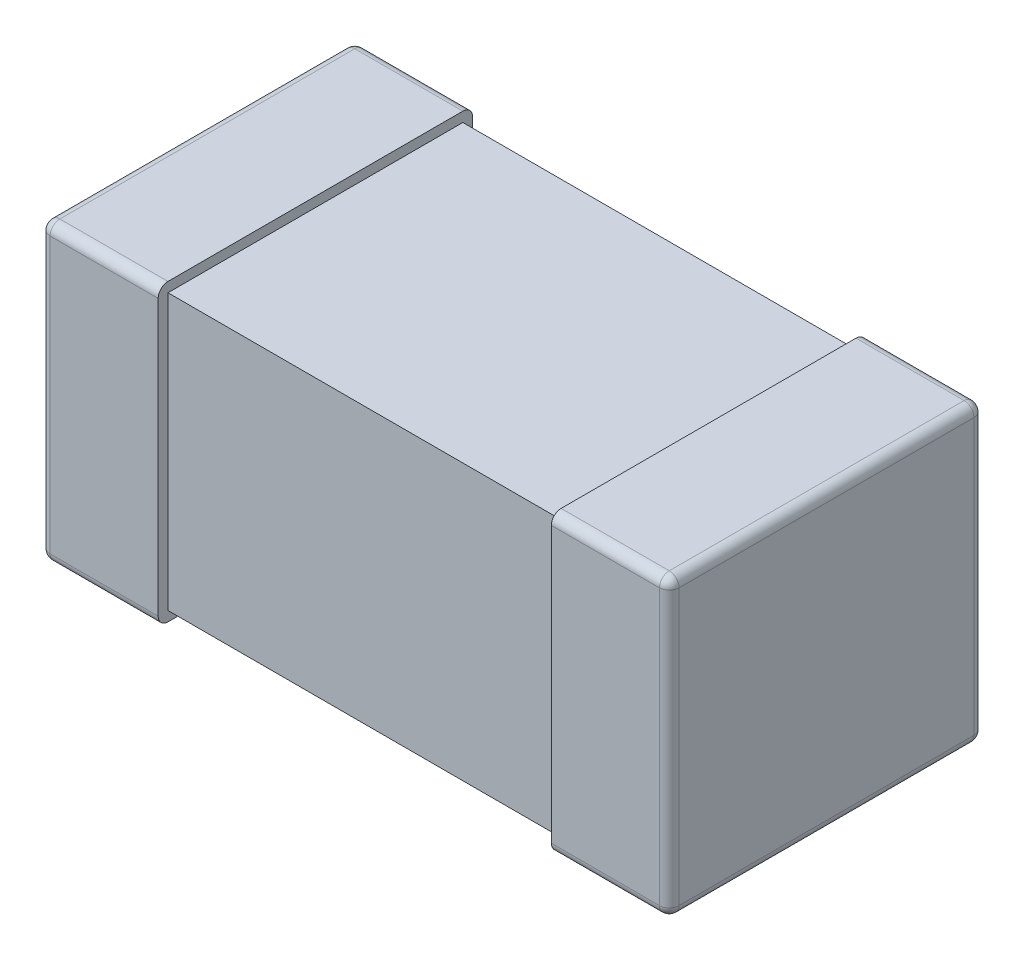
ISO-10303-21;
HEADER;
FILE_DESCRIPTION(('STEP AP214'),'2;1');
FILE_NAME('part.step','',(''),(''),'','','');
FILE_SCHEMA(('AUTOMOTIVE_DESIGN { 1 0 10303 214 1 1 1 1 }'));
ENDSEC;
DATA;
#1=APPLICATION_CONTEXT('core data for automotive mechanical design processes');
#2=APPLICATION_PROTOCOL_DEFINITION('international standard','automotive_design',2000,#1);
#3=PRODUCT_CONTEXT('',#1,'mechanical');
#4=PRODUCT('Part','Part','',(#3));
#5=PRODUCT_RELATED_PRODUCT_CATEGORY('part','',(#4));
#6=PRODUCT_DEFINITION_FORMATION('','',#4);
#7=PRODUCT_DEFINITION_CONTEXT('part definition',#1,'design');
#8=PRODUCT_DEFINITION('design','',#6,#7);
#9=PRODUCT_DEFINITION_SHAPE('','',#8);
#10=(LENGTH_UNIT() NAMED_UNIT(*) SI_UNIT(.MILLI.,.METRE.));
#11=(NAMED_UNIT(*) PLANE_ANGLE_UNIT() SI_UNIT($,.RADIAN.));
#12=(NAMED_UNIT(*) SI_UNIT($,.STERADIAN.) SOLID_ANGLE_UNIT());
#13=UNCERTAINTY_MEASURE_WITH_UNIT(LENGTH_MEASURE(1.E-05),#10,'distance_accuracy_value','');
#14=(GEOMETRIC_REPRESENTATION_CONTEXT(3) GLOBAL_UNCERTAINTY_ASSIGNED_CONTEXT((#13)) GLOBAL_UNIT_ASSIGNED_CONTEXT((#10,
#11,#12)) REPRESENTATION_CONTEXT('',''));
#15=CARTESIAN_POINT('',(0.,0.,0.));
#16=DIRECTION('',(0.,0.,1.));
#17=DIRECTION('',(1.,0.,0.));
#18=AXIS2_PLACEMENT_3D('',#15,#16,#17);
#19=CARTESIAN_POINT('',(1.6,-0.05,-0.8));
#20=DIRECTION('',(-1.,0.,0.));
#21=DIRECTION('',(0.,0.,1.));
#22=AXIS2_PLACEMENT_3D('',#19,#20,#21);
#23=PLANE('',#22);
#24=DIRECTION('',(0.,0.,-1.));
#25=VECTOR('',#24,1.);
#26=CARTESIAN_POINT('',(1.6,1.4,-0.8));
#27=LINE('',#26,#25);
#28=CARTESIAN_POINT('',(1.6,1.4,0.75));
#29=VERTEX_POINT('',#28);
#30=CARTESIAN_POINT('',(1.6,1.4,-0.75));
#31=VERTEX_POINT('',#30);
#32=EDGE_CURVE('E505',#29,#31,#27,.T.);
#33=ORIENTED_EDGE('',*,*,#32,.F.);
#34=DIRECTION('',(0.,1.,0.));
#35=VECTOR('',#34,1.);
#36=CARTESIAN_POINT('',(1.6,-0.05,0.75));
#37=LINE('',#36,#35);
#38=CARTESIAN_POINT('',(1.6,0.,0.75));
#39=VERTEX_POINT('',#38);
#40=EDGE_CURVE('E439',#39,#29,#37,.T.);
#41=ORIENTED_EDGE('',*,*,#40,.F.);
#42=DIRECTION('',(0.,0.,1.));
#43=VECTOR('',#42,1.);
#44=CARTESIAN_POINT('',(1.6,0.,0.8));
#45=LINE('',#44,#43);
#46=CARTESIAN_POINT('',(1.6,0.,-0.75));
#47=VERTEX_POINT('',#46);
#48=EDGE_CURVE('E496',#47,#39,#45,.T.);
#49=ORIENTED_EDGE('',*,*,#48,.F.);
#50=DIRECTION('',(0.,1.,0.));
#51=VECTOR('',#50,1.);
#52=CARTESIAN_POINT('',(1.6,-0.05,-0.75));
#53=LINE('',#52,#51);
#54=EDGE_CURVE('E390',#31,#47,#53,.F.);
#55=ORIENTED_EDGE('',*,*,#54,.F.);
#56=EDGE_LOOP('',(#33,#41,#49,#55));
#57=FACE_BOUND('',#56,.T.);
#58=ADVANCED_FACE('F16',(#57),#23,.F.);
#59=CARTESIAN_POINT('',(-1.6,-0.05,-0.8));
#60=DIRECTION('',(-1.,0.,0.));
#61=DIRECTION('',(0.,0.,1.));
#62=AXIS2_PLACEMENT_3D('',#59,#60,#61);
#63=PLANE('',#62);
#64=DIRECTION('',(0.,0.,-1.));
#65=VECTOR('',#64,1.);
#66=CARTESIAN_POINT('',(-1.6,0.,-0.8));
#67=LINE('',#66,#65);
#68=CARTESIAN_POINT('',(-1.6,0.,0.75));
#69=VERTEX_POINT('',#68);
#70=CARTESIAN_POINT('',(-1.6,0.,-0.75));
#71=VERTEX_POINT('',#70);
#72=EDGE_CURVE('E380',#69,#71,#67,.T.);
#73=ORIENTED_EDGE('',*,*,#72,.F.);
#74=DIRECTION('',(0.,1.,0.));
#75=VECTOR('',#74,1.);
#76=CARTESIAN_POINT('',(-1.6,-0.05,0.75));
#77=LINE('',#76,#75);
#78=CARTESIAN_POINT('',(-1.6,1.4,0.75));
#79=VERTEX_POINT('',#78);
#80=EDGE_CURVE('E479',#79,#69,#77,.F.);
#81=ORIENTED_EDGE('',*,*,#80,.F.);
#82=DIRECTION('',(0.,0.,1.));
#83=VECTOR('',#82,1.);
#84=CARTESIAN_POINT('',(-1.6,1.4,0.8));
#85=LINE('',#84,#83);
#86=CARTESIAN_POINT('',(-1.6,1.4,-0.75));
#87=VERTEX_POINT('',#86);
#88=EDGE_CURVE('E340',#87,#79,#85,.T.);
#89=ORIENTED_EDGE('',*,*,#88,.F.);
#90=DIRECTION('',(0.,1.,0.));
#91=VECTOR('',#90,1.);
#92=CARTESIAN_POINT('',(-1.6,-0.05,-0.75));
#93=LINE('',#92,#91);
#94=EDGE_CURVE('E488',#71,#87,#93,.T.);
#95=ORIENTED_EDGE('',*,*,#94,.F.);
#96=EDGE_LOOP('',(#73,#81,#89,#95));
#97=FACE_BOUND('',#96,.T.);
#98=ADVANCED_FACE('F469',(#97),#63,.T.);
#99=CARTESIAN_POINT('',(1.55,1.4,-0.75));
#100=DIRECTION('',(1.,0.,0.));
#101=DIRECTION('',(0.,0.,-1.));
#102=AXIS2_PLACEMENT_3D('',#99,#100,#101);
#103=SPHERICAL_SURFACE('',#102,0.05);
#104=CARTESIAN_POINT('',(1.55,1.4,-0.75));
#105=DIRECTION('',(0.,0.,-1.));
#106=DIRECTION('',(-1.,0.,0.));
#107=AXIS2_PLACEMENT_3D('',#104,#105,#106);
#108=CIRCLE('',#107,0.05);
#109=CARTESIAN_POINT('',(1.55,1.45,-0.75));
#110=VERTEX_POINT('',#109);
#111=EDGE_CURVE('E508',#31,#110,#108,.F.);
#112=ORIENTED_EDGE('',*,*,#111,.F.);
#113=CARTESIAN_POINT('',(1.55,1.4,-0.75));
#114=DIRECTION('',(0.,1.,0.));
#115=DIRECTION('',(0.,0.,1.));
#116=AXIS2_PLACEMENT_3D('',#113,#114,#115);
#117=CIRCLE('',#116,0.05);
#118=CARTESIAN_POINT('',(1.55,1.4,-0.8));
#119=VERTEX_POINT('',#118);
#120=EDGE_CURVE('E401',#119,#31,#117,.F.);
#121=ORIENTED_EDGE('',*,*,#120,.F.);
#122=CARTESIAN_POINT('',(1.55,1.4,-0.75));
#123=DIRECTION('',(-1.,0.,0.));
#124=DIRECTION('',(0.,0.,1.));
#125=AXIS2_PLACEMENT_3D('',#122,#123,#124);
#126=CIRCLE('',#125,0.05);
#127=EDGE_CURVE('E397',#110,#119,#126,.T.);
#128=ORIENTED_EDGE('',*,*,#127,.F.);
#129=EDGE_LOOP('',(#112,#121,#128));
#130=FACE_BOUND('',#129,.T.);
#131=ADVANCED_FACE('F465',(#130),#103,.T.);
#132=CARTESIAN_POINT('',(1.55,1.4,-0.8));
#133=DIRECTION('',(0.,0.,-1.));
#134=DIRECTION('',(-1.,0.,0.));
#135=AXIS2_PLACEMENT_3D('',#132,#133,#134);
#136=CYLINDRICAL_SURFACE('',#135,0.05);
#137=ORIENTED_EDGE('',*,*,#111,.T.);
#138=DIRECTION('',(0.,0.,1.));
#139=VECTOR('',#138,1.);
#140=CARTESIAN_POINT('',(1.55,1.45,0.8));
#141=LINE('',#140,#139);
#142=CARTESIAN_POINT('',(1.55,1.45,0.75));
#143=VERTEX_POINT('',#142);
#144=EDGE_CURVE('E193',#143,#110,#141,.F.);
#145=ORIENTED_EDGE('',*,*,#144,.F.);
#146=CARTESIAN_POINT('',(1.55,1.4,0.75));
#147=DIRECTION('',(0.,0.,1.));
#148=DIRECTION('',(1.,0.,0.));
#149=AXIS2_PLACEMENT_3D('',#146,#147,#148);
#150=CIRCLE('',#149,0.05);
#151=EDGE_CURVE('E445',#29,#143,#150,.T.);
#152=ORIENTED_EDGE('',*,*,#151,.F.);
#153=ORIENTED_EDGE('',*,*,#32,.T.);
#154=EDGE_LOOP('',(#137,#145,#152,#153));
#155=FACE_BOUND('',#154,.T.);
#156=ADVANCED_FACE('F461',(#155),#136,.T.);
#157=CARTESIAN_POINT('',(1.55,1.4,0.75));
#158=DIRECTION('',(1.,0.,0.));
#159=DIRECTION('',(0.,0.,-1.));
#160=AXIS2_PLACEMENT_3D('',#157,#158,#159);
#161=SPHERICAL_SURFACE('',#160,0.05);
#162=CARTESIAN_POINT('',(1.55,1.4,0.75));
#163=DIRECTION('',(1.,0.,0.));
#164=DIRECTION('',(0.,0.,-1.));
#165=AXIS2_PLACEMENT_3D('',#162,#163,#164);
#166=CIRCLE('',#165,0.05);
#167=CARTESIAN_POINT('',(1.55,1.4,0.8));
#168=VERTEX_POINT('',#167);
#169=EDGE_CURVE('E194',#168,#143,#166,.F.);
#170=ORIENTED_EDGE('',*,*,#169,.F.);
#171=CARTESIAN_POINT('',(1.55,1.4,0.75));
#172=DIRECTION('',(0.,1.,0.));
#173=DIRECTION('',(0.,0.,1.));
#174=AXIS2_PLACEMENT_3D('',#171,#172,#173);
#175=CIRCLE('',#174,0.05);
#176=EDGE_CURVE('E442',#29,#168,#175,.F.);
#177=ORIENTED_EDGE('',*,*,#176,.F.);
#178=ORIENTED_EDGE('',*,*,#151,.T.);
#179=EDGE_LOOP('',(#170,#177,#178));
#180=FACE_BOUND('',#179,.T.);
#181=ADVANCED_FACE('F458',(#180),#161,.T.);
#182=CARTESIAN_POINT('',(1.55,-0.05,0.75));
#183=DIRECTION('',(0.,1.,0.));
#184=DIRECTION('',(0.,0.,1.));
#185=AXIS2_PLACEMENT_3D('',#182,#183,#184);
#186=CYLINDRICAL_SURFACE('',#185,0.05);
#187=CARTESIAN_POINT('',(1.55,0.,0.75));
#188=DIRECTION('',(0.,-1.,0.));
#189=DIRECTION('',(1.,0.,0.));
#190=AXIS2_PLACEMENT_3D('',#187,#188,#189);
#191=CIRCLE('',#190,0.05);
#192=CARTESIAN_POINT('',(1.55,0.,0.8));
#193=VERTEX_POINT('',#192);
#194=EDGE_CURVE('E435',#39,#193,#191,.T.);
#195=ORIENTED_EDGE('',*,*,#194,.F.);
#196=ORIENTED_EDGE('',*,*,#40,.T.);
#197=ORIENTED_EDGE('',*,*,#176,.T.);
#198=DIRECTION('',(0.,1.,0.));
#199=VECTOR('',#198,1.);
#200=CARTESIAN_POINT('',(1.55,-0.05,0.8));
#201=LINE('',#200,#199);
#202=EDGE_CURVE('E293',#168,#193,#201,.F.);
#203=ORIENTED_EDGE('',*,*,#202,.T.);
#204=EDGE_LOOP('',(#195,#196,#197,#203));
#205=FACE_BOUND('',#204,.T.);
#206=ADVANCED_FACE('F427',(#205),#186,.T.);
#207=CARTESIAN_POINT('',(1.55,0.,0.75));
#208=DIRECTION('',(1.,0.,0.));
#209=DIRECTION('',(0.,0.,-1.));
#210=AXIS2_PLACEMENT_3D('',#207,#208,#209);
#211=SPHERICAL_SURFACE('',#210,0.05);
#212=CARTESIAN_POINT('',(1.55,0.,0.75));
#213=DIRECTION('',(-1.,0.,0.));
#214=DIRECTION('',(0.,0.,1.));
#215=AXIS2_PLACEMENT_3D('',#212,#213,#214);
#216=CIRCLE('',#215,0.05);
#217=CARTESIAN_POINT('',(1.55,-0.05,0.75));
#218=VERTEX_POINT('',#217);
#219=EDGE_CURVE('E287',#218,#193,#216,.T.);
#220=ORIENTED_EDGE('',*,*,#219,.F.);
#221=CARTESIAN_POINT('',(1.55,0.,0.75));
#222=DIRECTION('',(0.,0.,1.));
#223=DIRECTION('',(1.,0.,0.));
#224=AXIS2_PLACEMENT_3D('',#221,#222,#223);
#225=CIRCLE('',#224,0.05);
#226=EDGE_CURVE('E438',#39,#218,#225,.F.);
#227=ORIENTED_EDGE('',*,*,#226,.F.);
#228=ORIENTED_EDGE('',*,*,#194,.T.);
#229=EDGE_LOOP('',(#220,#227,#228));
#230=FACE_BOUND('',#229,.T.);
#231=ADVANCED_FACE('F422',(#230),#211,.T.);
#232=CARTESIAN_POINT('',(1.55,0.,0.8));
#233=DIRECTION('',(0.,0.,1.));
#234=DIRECTION('',(1.,0.,0.));
#235=AXIS2_PLACEMENT_3D('',#232,#233,#234);
#236=CYLINDRICAL_SURFACE('',#235,0.05);
#237=CARTESIAN_POINT('',(1.55,0.,-0.75));
#238=DIRECTION('',(0.,0.,-1.));
#239=DIRECTION('',(1.,0.,0.));
#240=AXIS2_PLACEMENT_3D('',#237,#238,#239);
#241=CIRCLE('',#240,0.05);
#242=CARTESIAN_POINT('',(1.55,-0.05,-0.75));
#243=VERTEX_POINT('',#242);
#244=EDGE_CURVE('E404',#47,#243,#241,.T.);
#245=ORIENTED_EDGE('',*,*,#244,.F.);
#246=ORIENTED_EDGE('',*,*,#48,.T.);
#247=ORIENTED_EDGE('',*,*,#226,.T.);
#248=DIRECTION('',(0.,0.,1.));
#249=VECTOR('',#248,1.);
#250=CARTESIAN_POINT('',(1.55,-0.05,0.8));
#251=LINE('',#250,#249);
#252=EDGE_CURVE('E281',#218,#243,#251,.F.);
#253=ORIENTED_EDGE('',*,*,#252,.T.);
#254=EDGE_LOOP('',(#245,#246,#247,#253));
#255=FACE_BOUND('',#254,.T.);
#256=ADVANCED_FACE('F418',(#255),#236,.T.);
#257=CARTESIAN_POINT('',(1.55,0.,-0.75));
#258=DIRECTION('',(1.,0.,0.));
#259=DIRECTION('',(0.,0.,-1.));
#260=AXIS2_PLACEMENT_3D('',#257,#258,#259);
#261=SPHERICAL_SURFACE('',#260,0.05);
#262=ORIENTED_EDGE('',*,*,#244,.T.);
#263=CARTESIAN_POINT('',(1.55,0.,-0.75));
#264=DIRECTION('',(1.,0.,0.));
#265=DIRECTION('',(0.,0.,-1.));
#266=AXIS2_PLACEMENT_3D('',#263,#264,#265);
#267=CIRCLE('',#266,0.05);
#268=CARTESIAN_POINT('',(1.55,0.,-0.8));
#269=VERTEX_POINT('',#268);
#270=EDGE_CURVE('E275',#269,#243,#267,.F.);
#271=ORIENTED_EDGE('',*,*,#270,.F.);
#272=CARTESIAN_POINT('',(1.55,0.,-0.75));
#273=DIRECTION('',(0.,1.,0.));
#274=DIRECTION('',(0.,0.,1.));
#275=AXIS2_PLACEMENT_3D('',#272,#273,#274);
#276=CIRCLE('',#275,0.05);
#277=EDGE_CURVE('E387',#47,#269,#276,.T.);
#278=ORIENTED_EDGE('',*,*,#277,.F.);
#279=EDGE_LOOP('',(#262,#271,#278));
#280=FACE_BOUND('',#279,.T.);
#281=ADVANCED_FACE('F414',(#280),#261,.T.);
#282=CARTESIAN_POINT('',(1.55,-0.05,-0.75));
#283=DIRECTION('',(0.,1.,0.));
#284=DIRECTION('',(0.,0.,1.));
#285=AXIS2_PLACEMENT_3D('',#282,#283,#284);
#286=CYLINDRICAL_SURFACE('',#285,0.05);
#287=ORIENTED_EDGE('',*,*,#277,.T.);
#288=DIRECTION('',(0.,1.,0.));
#289=VECTOR('',#288,1.);
#290=CARTESIAN_POINT('',(1.55,-0.05,-0.8));
#291=LINE('',#290,#289);
#292=EDGE_CURVE('E263',#269,#119,#291,.T.);
#293=ORIENTED_EDGE('',*,*,#292,.T.);
#294=ORIENTED_EDGE('',*,*,#120,.T.);
#295=ORIENTED_EDGE('',*,*,#54,.T.);
#296=EDGE_LOOP('',(#287,#293,#294,#295));
#297=FACE_BOUND('',#296,.T.);
#298=ADVANCED_FACE('F417',(#297),#286,.T.);
#299=CARTESIAN_POINT('',(-1.55,0.,-0.8));
#300=DIRECTION('',(0.,0.,-1.));
#301=DIRECTION('',(-1.,0.,0.));
#302=AXIS2_PLACEMENT_3D('',#299,#300,#301);
#303=CYLINDRICAL_SURFACE('',#302,0.05);
#304=CARTESIAN_POINT('',(-1.55,0.,-0.75));
#305=DIRECTION('',(0.,0.,-1.));
#306=DIRECTION('',(1.,0.,0.));
#307=AXIS2_PLACEMENT_3D('',#304,#305,#306);
#308=CIRCLE('',#307,0.05);
#309=CARTESIAN_POINT('',(-1.55,-0.05,-0.75));
#310=VERTEX_POINT('',#309);
#311=EDGE_CURVE('E376',#310,#71,#308,.T.);
#312=ORIENTED_EDGE('',*,*,#311,.F.);
#313=DIRECTION('',(0.,0.,1.));
#314=VECTOR('',#313,1.);
#315=CARTESIAN_POINT('',(-1.55,-0.05,0.8));
#316=LINE('',#315,#314);
#317=CARTESIAN_POINT('',(-1.55,-0.05,0.75));
#318=VERTEX_POINT('',#317);
#319=EDGE_CURVE('E258',#310,#318,#316,.T.);
#320=ORIENTED_EDGE('',*,*,#319,.T.);
#321=CARTESIAN_POINT('',(-1.55,0.,0.75));
#322=DIRECTION('',(0.,0.,-1.));
#323=DIRECTION('',(1.,0.,0.));
#324=AXIS2_PLACEMENT_3D('',#321,#322,#323);
#325=CIRCLE('',#324,0.05);
#326=EDGE_CURVE('E311',#69,#318,#325,.F.);
#327=ORIENTED_EDGE('',*,*,#326,.F.);
#328=ORIENTED_EDGE('',*,*,#72,.T.);
#329=EDGE_LOOP('',(#312,#320,#327,#328));
#330=FACE_BOUND('',#329,.T.);
#331=ADVANCED_FACE('F368',(#330),#303,.T.);
#332=CARTESIAN_POINT('',(-1.55,0.,-0.75));
#333=DIRECTION('',(1.,0.,0.));
#334=DIRECTION('',(0.,0.,-1.));
#335=AXIS2_PLACEMENT_3D('',#332,#333,#334);
#336=SPHERICAL_SURFACE('',#335,0.05);
#337=CARTESIAN_POINT('',(-1.55,0.,-0.75));
#338=DIRECTION('',(0.,1.,0.));
#339=DIRECTION('',(0.,0.,1.));
#340=AXIS2_PLACEMENT_3D('',#337,#338,#339);
#341=CIRCLE('',#340,0.05);
#342=CARTESIAN_POINT('',(-1.55,0.,-0.8));
#343=VERTEX_POINT('',#342);
#344=EDGE_CURVE('E379',#343,#71,#341,.T.);
#345=ORIENTED_EDGE('',*,*,#344,.F.);
#346=CARTESIAN_POINT('',(-1.55,0.,-0.75));
#347=DIRECTION('',(1.,0.,0.));
#348=DIRECTION('',(0.,0.,-1.));
#349=AXIS2_PLACEMENT_3D('',#346,#347,#348);
#350=CIRCLE('',#349,0.05);
#351=EDGE_CURVE('E252',#310,#343,#350,.T.);
#352=ORIENTED_EDGE('',*,*,#351,.F.);
#353=ORIENTED_EDGE('',*,*,#311,.T.);
#354=EDGE_LOOP('',(#345,#352,#353));
#355=FACE_BOUND('',#354,.T.);
#356=ADVANCED_FACE('F363',(#355),#336,.T.);
#357=CARTESIAN_POINT('',(-1.55,-0.05,-0.75));
#358=DIRECTION('',(0.,1.,0.));
#359=DIRECTION('',(0.,0.,1.));
#360=AXIS2_PLACEMENT_3D('',#357,#358,#359);
#361=CYLINDRICAL_SURFACE('',#360,0.05);
#362=ORIENTED_EDGE('',*,*,#344,.T.);
#363=ORIENTED_EDGE('',*,*,#94,.T.);
#364=CARTESIAN_POINT('',(-1.55,1.4,-0.75));
#365=DIRECTION('',(0.,1.,0.));
#366=DIRECTION('',(1.,0.,0.));
#367=AXIS2_PLACEMENT_3D('',#364,#365,#366);
#368=CIRCLE('',#367,0.05);
#369=CARTESIAN_POINT('',(-1.55,1.4,-0.8));
#370=VERTEX_POINT('',#369);
#371=EDGE_CURVE('E346',#370,#87,#368,.T.);
#372=ORIENTED_EDGE('',*,*,#371,.F.);
#373=DIRECTION('',(0.,1.,0.));
#374=VECTOR('',#373,1.);
#375=CARTESIAN_POINT('',(-1.55,-0.05,-0.8));
#376=LINE('',#375,#374);
#377=EDGE_CURVE('E246',#343,#370,#376,.T.);
#378=ORIENTED_EDGE('',*,*,#377,.F.);
#379=EDGE_LOOP('',(#362,#363,#372,#378));
#380=FACE_BOUND('',#379,.T.);
#381=ADVANCED_FACE('F359',(#380),#361,.T.);
#382=CARTESIAN_POINT('',(-1.55,1.4,-0.75));
#383=DIRECTION('',(1.,0.,0.));
#384=DIRECTION('',(0.,0.,-1.));
#385=AXIS2_PLACEMENT_3D('',#382,#383,#384);
#386=SPHERICAL_SURFACE('',#385,0.05);
#387=CARTESIAN_POINT('',(-1.55,1.4,-0.75));
#388=DIRECTION('',(-1.,0.,0.));
#389=DIRECTION('',(0.,0.,1.));
#390=AXIS2_PLACEMENT_3D('',#387,#388,#389);
#391=CIRCLE('',#390,0.05);
#392=CARTESIAN_POINT('',(-1.55,1.45,-0.75));
#393=VERTEX_POINT('',#392);
#394=EDGE_CURVE('E240',#370,#393,#391,.F.);
#395=ORIENTED_EDGE('',*,*,#394,.F.);
#396=ORIENTED_EDGE('',*,*,#371,.T.);
#397=CARTESIAN_POINT('',(-1.55,1.4,-0.75));
#398=DIRECTION('',(0.,0.,1.));
#399=DIRECTION('',(1.,0.,0.));
#400=AXIS2_PLACEMENT_3D('',#397,#398,#399);
#401=CIRCLE('',#400,0.05);
#402=EDGE_CURVE('E343',#393,#87,#401,.T.);
#403=ORIENTED_EDGE('',*,*,#402,.F.);
#404=EDGE_LOOP('',(#395,#396,#403));
#405=FACE_BOUND('',#404,.T.);
#406=ADVANCED_FACE('F356',(#405),#386,.T.);
#407=CARTESIAN_POINT('',(-1.55,1.4,0.8));
#408=DIRECTION('',(0.,0.,1.));
#409=DIRECTION('',(1.,0.,0.));
#410=AXIS2_PLACEMENT_3D('',#407,#408,#409);
#411=CYLINDRICAL_SURFACE('',#410,0.05);
#412=ORIENTED_EDGE('',*,*,#402,.T.);
#413=ORIENTED_EDGE('',*,*,#88,.T.);
#414=CARTESIAN_POINT('',(-1.55,1.4,0.75));
#415=DIRECTION('',(0.,0.,1.));
#416=DIRECTION('',(1.,0.,0.));
#417=AXIS2_PLACEMENT_3D('',#414,#415,#416);
#418=CIRCLE('',#417,0.05);
#419=CARTESIAN_POINT('',(-1.55,1.45,0.75));
#420=VERTEX_POINT('',#419);
#421=EDGE_CURVE('E336',#420,#79,#418,.T.);
#422=ORIENTED_EDGE('',*,*,#421,.F.);
#423=DIRECTION('',(0.,0.,1.));
#424=VECTOR('',#423,1.);
#425=CARTESIAN_POINT('',(-1.55,1.45,0.8));
#426=LINE('',#425,#424);
#427=EDGE_CURVE('E239',#393,#420,#426,.T.);
#428=ORIENTED_EDGE('',*,*,#427,.F.);
#429=EDGE_LOOP('',(#412,#413,#422,#428));
#430=FACE_BOUND('',#429,.T.);
#431=ADVANCED_FACE('F328',(#430),#411,.T.);
#432=CARTESIAN_POINT('',(-1.55,1.4,0.75));
#433=DIRECTION('',(1.,0.,0.));
#434=DIRECTION('',(0.,0.,-1.));
#435=AXIS2_PLACEMENT_3D('',#432,#433,#434);
#436=SPHERICAL_SURFACE('',#435,0.05);
#437=CARTESIAN_POINT('',(-1.55,1.4,0.75));
#438=DIRECTION('',(1.,0.,0.));
#439=DIRECTION('',(0.,0.,-1.));
#440=AXIS2_PLACEMENT_3D('',#437,#438,#439);
#441=CIRCLE('',#440,0.05);
#442=CARTESIAN_POINT('',(-1.55,1.4,0.8));
#443=VERTEX_POINT('',#442);
#444=EDGE_CURVE('E233',#420,#443,#441,.T.);
#445=ORIENTED_EDGE('',*,*,#444,.F.);
#446=ORIENTED_EDGE('',*,*,#421,.T.);
#447=CARTESIAN_POINT('',(-1.55,1.4,0.75));
#448=DIRECTION('',(0.,1.,0.));
#449=DIRECTION('',(0.,0.,1.));
#450=AXIS2_PLACEMENT_3D('',#447,#448,#449);
#451=CIRCLE('',#450,0.05);
#452=EDGE_CURVE('E339',#443,#79,#451,.F.);
#453=ORIENTED_EDGE('',*,*,#452,.F.);
#454=EDGE_LOOP('',(#445,#446,#453));
#455=FACE_BOUND('',#454,.T.);
#456=ADVANCED_FACE('F323',(#455),#436,.T.);
#457=CARTESIAN_POINT('',(-1.55,-0.05,0.75));
#458=DIRECTION('',(0.,1.,0.));
#459=DIRECTION('',(0.,0.,1.));
#460=AXIS2_PLACEMENT_3D('',#457,#458,#459);
#461=CYLINDRICAL_SURFACE('',#460,0.05);
#462=CARTESIAN_POINT('',(-1.55,0.,0.75));
#463=DIRECTION('',(0.,-1.,0.));
#464=DIRECTION('',(1.,0.,0.));
#465=AXIS2_PLACEMENT_3D('',#462,#463,#464);
#466=CIRCLE('',#465,0.05);
#467=CARTESIAN_POINT('',(-1.55,0.,0.8));
#468=VERTEX_POINT('',#467);
#469=EDGE_CURVE('E482',#468,#69,#466,.T.);
#470=ORIENTED_EDGE('',*,*,#469,.F.);
#471=DIRECTION('',(0.,1.,0.));
#472=VECTOR('',#471,1.);
#473=CARTESIAN_POINT('',(-1.55,-0.05,0.8));
#474=LINE('',#473,#472);
#475=EDGE_CURVE('E227',#443,#468,#474,.F.);
#476=ORIENTED_EDGE('',*,*,#475,.F.);
#477=ORIENTED_EDGE('',*,*,#452,.T.);
#478=ORIENTED_EDGE('',*,*,#80,.T.);
#479=EDGE_LOOP('',(#470,#476,#477,#478));
#480=FACE_BOUND('',#479,.T.);
#481=ADVANCED_FACE('F318',(#480),#461,.T.);
#482=CARTESIAN_POINT('',(-1.55,0.,0.75));
#483=DIRECTION('',(1.,0.,0.));
#484=DIRECTION('',(0.,0.,-1.));
#485=AXIS2_PLACEMENT_3D('',#482,#483,#484);
#486=SPHERICAL_SURFACE('',#485,0.05);
#487=ORIENTED_EDGE('',*,*,#469,.T.);
#488=ORIENTED_EDGE('',*,*,#326,.T.);
#489=CARTESIAN_POINT('',(-1.55,0.,0.75));
#490=DIRECTION('',(-1.,0.,0.));
#491=DIRECTION('',(0.,0.,1.));
#492=AXIS2_PLACEMENT_3D('',#489,#490,#491);
#493=CIRCLE('',#492,0.05);
#494=EDGE_CURVE('E216',#468,#318,#493,.F.);
#495=ORIENTED_EDGE('',*,*,#494,.F.);
#496=EDGE_LOOP('',(#487,#488,#495));
#497=FACE_BOUND('',#496,.T.);
#498=ADVANCED_FACE('F314',(#497),#486,.T.);
#499=CARTESIAN_POINT('',(1.6,1.4,-0.75));
#500=DIRECTION('',(-1.,0.,0.));
#501=DIRECTION('',(0.,0.,1.));
#502=AXIS2_PLACEMENT_3D('',#499,#500,#501);
#503=CYLINDRICAL_SURFACE('',#502,0.05);
#504=ORIENTED_EDGE('',*,*,#127,.T.);
#505=DIRECTION('',(1.,0.,0.));
#506=VECTOR('',#505,1.);
#507=CARTESIAN_POINT('',(1.6,1.4,-0.8));
#508=LINE('',#507,#506);
#509=CARTESIAN_POINT('',(1.,1.4,-0.8));
#510=VERTEX_POINT('',#509);
#511=EDGE_CURVE('E176',#119,#510,#508,.F.);
#512=ORIENTED_EDGE('',*,*,#511,.T.);
#513=CARTESIAN_POINT('',(1.,1.4,-0.75));
#514=DIRECTION('',(-1.,0.,0.));
#515=DIRECTION('',(0.,0.,1.));
#516=AXIS2_PLACEMENT_3D('',#513,#514,#515);
#517=CIRCLE('',#516,0.05);
#518=CARTESIAN_POINT('',(1.,1.45,-0.75));
#519=VERTEX_POINT('',#518);
#520=EDGE_CURVE('E19',#510,#519,#517,.F.);
#521=ORIENTED_EDGE('',*,*,#520,.T.);
#522=DIRECTION('',(1.,0.,0.));
#523=VECTOR('',#522,1.);
#524=CARTESIAN_POINT('',(1.6,1.45,-0.75));
#525=LINE('',#524,#523);
#526=EDGE_CURVE('E182',#110,#519,#525,.F.);
#527=ORIENTED_EDGE('',*,*,#526,.F.);
#528=EDGE_LOOP('',(#504,#512,#521,#527));
#529=FACE_BOUND('',#528,.T.);
#530=ADVANCED_FACE('F181',(#529),#503,.T.);
#531=CARTESIAN_POINT('',(1.6,1.45,0.8));
#532=DIRECTION('',(0.,1.,0.));
#533=DIRECTION('',(0.,0.,1.));
#534=AXIS2_PLACEMENT_3D('',#531,#532,#533);
#535=PLANE('',#534);
#536=DIRECTION('',(0.,0.,-1.));
#537=VECTOR('',#536,1.);
#538=CARTESIAN_POINT('',(1.,1.45,-0.8));
#539=LINE('',#538,#537);
#540=CARTESIAN_POINT('',(1.,1.45,0.75));
#541=VERTEX_POINT('',#540);
#542=EDGE_CURVE('E187',#519,#541,#539,.F.);
#543=ORIENTED_EDGE('',*,*,#542,.T.);
#544=DIRECTION('',(1.,0.,0.));
#545=VECTOR('',#544,1.);
#546=CARTESIAN_POINT('',(1.6,1.45,0.75));
#547=LINE('',#546,#545);
#548=EDGE_CURVE('E294',#143,#541,#547,.F.);
#549=ORIENTED_EDGE('',*,*,#548,.F.);
#550=ORIENTED_EDGE('',*,*,#144,.T.);
#551=ORIENTED_EDGE('',*,*,#526,.T.);
#552=EDGE_LOOP('',(#543,#549,#550,#551));
#553=FACE_BOUND('',#552,.T.);
#554=ADVANCED_FACE('F190',(#553),#535,.T.);
#555=CARTESIAN_POINT('',(1.6,1.4,0.75));
#556=DIRECTION('',(1.,0.,0.));
#557=DIRECTION('',(0.,0.,-1.));
#558=AXIS2_PLACEMENT_3D('',#555,#556,#557);
#559=CYLINDRICAL_SURFACE('',#558,0.05);
#560=CARTESIAN_POINT('',(1.,1.4,0.75));
#561=DIRECTION('',(1.,0.,0.));
#562=DIRECTION('',(0.,0.,-1.));
#563=AXIS2_PLACEMENT_3D('',#560,#561,#562);
#564=CIRCLE('',#563,0.05);
#565=CARTESIAN_POINT('',(1.,1.4,0.8));
#566=VERTEX_POINT('',#565);
#567=EDGE_CURVE('E201',#541,#566,#564,.T.);
#568=ORIENTED_EDGE('',*,*,#567,.T.);
#569=DIRECTION('',(-1.,0.,0.));
#570=VECTOR('',#569,1.);
#571=CARTESIAN_POINT('',(1.6,1.4,0.8));
#572=LINE('',#571,#570);
#573=EDGE_CURVE('E290',#566,#168,#572,.F.);
#574=ORIENTED_EDGE('',*,*,#573,.T.);
#575=ORIENTED_EDGE('',*,*,#169,.T.);
#576=ORIENTED_EDGE('',*,*,#548,.T.);
#577=EDGE_LOOP('',(#568,#574,#575,#576));
#578=FACE_BOUND('',#577,.T.);
#579=ADVANCED_FACE('F569',(#578),#559,.T.);
#580=CARTESIAN_POINT('',(1.6,-0.05,0.8));
#581=DIRECTION('',(0.,0.,-1.));
#582=DIRECTION('',(-1.,0.,0.));
#583=AXIS2_PLACEMENT_3D('',#580,#581,#582);
#584=PLANE('',#583);
#585=DIRECTION('',(-1.,0.,0.));
#586=VECTOR('',#585,1.);
#587=CARTESIAN_POINT('',(1.6,0.,0.8));
#588=LINE('',#587,#586);
#589=CARTESIAN_POINT('',(1.,0.,0.8));
#590=VERTEX_POINT('',#589);
#591=EDGE_CURVE('E282',#193,#590,#588,.T.);
#592=ORIENTED_EDGE('',*,*,#591,.F.);
#593=ORIENTED_EDGE('',*,*,#202,.F.);
#594=ORIENTED_EDGE('',*,*,#573,.F.);
#595=DIRECTION('',(0.,1.,0.));
#596=VECTOR('',#595,1.);
#597=CARTESIAN_POINT('',(1.,-0.05,0.8));
#598=LINE('',#597,#596);
#599=EDGE_CURVE('E203',#566,#590,#598,.F.);
#600=ORIENTED_EDGE('',*,*,#599,.T.);
#601=EDGE_LOOP('',(#592,#593,#594,#600));
#602=FACE_BOUND('',#601,.T.);
#603=ADVANCED_FACE('F539',(#602),#584,.F.);
#604=CARTESIAN_POINT('',(1.6,0.,0.75));
#605=DIRECTION('',(-1.,0.,0.));
#606=DIRECTION('',(0.,0.,1.));
#607=AXIS2_PLACEMENT_3D('',#604,#605,#606);
#608=CYLINDRICAL_SURFACE('',#607,0.05);
#609=ORIENTED_EDGE('',*,*,#219,.T.);
#610=ORIENTED_EDGE('',*,*,#591,.T.);
#611=CARTESIAN_POINT('',(1.,0.,0.75));
#612=DIRECTION('',(-1.,0.,0.));
#613=DIRECTION('',(0.,0.,1.));
#614=AXIS2_PLACEMENT_3D('',#611,#612,#613);
#615=CIRCLE('',#614,0.05);
#616=CARTESIAN_POINT('',(1.,-0.05,0.75));
#617=VERTEX_POINT('',#616);
#618=EDGE_CURVE('E532',#590,#617,#615,.F.);
#619=ORIENTED_EDGE('',*,*,#618,.T.);
#620=DIRECTION('',(1.,0.,0.));
#621=VECTOR('',#620,1.);
#622=CARTESIAN_POINT('',(1.6,-0.05,0.75));
#623=LINE('',#622,#621);
#624=EDGE_CURVE('E278',#617,#218,#623,.T.);
#625=ORIENTED_EDGE('',*,*,#624,.T.);
#626=EDGE_LOOP('',(#609,#610,#619,#625));
#627=FACE_BOUND('',#626,.T.);
#628=ADVANCED_FACE('F542',(#627),#608,.T.);
#629=CARTESIAN_POINT('',(1.6,-0.05,0.8));
#630=DIRECTION('',(0.,1.,0.));
#631=DIRECTION('',(0.,0.,1.));
#632=AXIS2_PLACEMENT_3D('',#629,#630,#631);
#633=PLANE('',#632);
#634=DIRECTION('',(1.,0.,0.));
#635=VECTOR('',#634,1.);
#636=CARTESIAN_POINT('',(1.6,-0.05,-0.75));
#637=LINE('',#636,#635);
#638=CARTESIAN_POINT('',(1.,-0.05,-0.75));
#639=VERTEX_POINT('',#638);
#640=EDGE_CURVE('E270',#243,#639,#637,.F.);
#641=ORIENTED_EDGE('',*,*,#640,.F.);
#642=ORIENTED_EDGE('',*,*,#252,.F.);
#643=ORIENTED_EDGE('',*,*,#624,.F.);
#644=DIRECTION('',(0.,0.,-1.));
#645=VECTOR('',#644,1.);
#646=CARTESIAN_POINT('',(1.,-0.05,-0.8));
#647=LINE('',#646,#645);
#648=EDGE_CURVE('E531',#617,#639,#647,.T.);
#649=ORIENTED_EDGE('',*,*,#648,.T.);
#650=EDGE_LOOP('',(#641,#642,#643,#649));
#651=FACE_BOUND('',#650,.T.);
#652=ADVANCED_FACE('F546',(#651),#633,.F.);
#653=CARTESIAN_POINT('',(1.6,0.,-0.75));
#654=DIRECTION('',(1.,0.,0.));
#655=DIRECTION('',(0.,0.,-1.));
#656=AXIS2_PLACEMENT_3D('',#653,#654,#655);
#657=CYLINDRICAL_SURFACE('',#656,0.05);
#658=ORIENTED_EDGE('',*,*,#270,.T.);
#659=ORIENTED_EDGE('',*,*,#640,.T.);
#660=CARTESIAN_POINT('',(1.,0.,-0.75));
#661=DIRECTION('',(1.,0.,0.));
#662=DIRECTION('',(0.,0.,-1.));
#663=AXIS2_PLACEMENT_3D('',#660,#661,#662);
#664=CIRCLE('',#663,0.05);
#665=CARTESIAN_POINT('',(1.,0.,-0.8));
#666=VERTEX_POINT('',#665);
#667=EDGE_CURVE('E528',#639,#666,#664,.T.);
#668=ORIENTED_EDGE('',*,*,#667,.T.);
#669=DIRECTION('',(1.,0.,0.));
#670=VECTOR('',#669,1.);
#671=CARTESIAN_POINT('',(1.6,0.,-0.8));
#672=LINE('',#671,#670);
#673=EDGE_CURVE('E264',#666,#269,#672,.T.);
#674=ORIENTED_EDGE('',*,*,#673,.T.);
#675=EDGE_LOOP('',(#658,#659,#668,#674));
#676=FACE_BOUND('',#675,.T.);
#677=ADVANCED_FACE('F549',(#676),#657,.T.);
#678=CARTESIAN_POINT('',(1.6,-0.05,-0.8));
#679=DIRECTION('',(0.,0.,1.));
#680=DIRECTION('',(1.,0.,0.));
#681=AXIS2_PLACEMENT_3D('',#678,#679,#680);
#682=PLANE('',#681);
#683=ORIENTED_EDGE('',*,*,#673,.F.);
#684=DIRECTION('',(0.,1.,0.));
#685=VECTOR('',#684,1.);
#686=CARTESIAN_POINT('',(1.,-0.05,-0.8));
#687=LINE('',#686,#685);
#688=EDGE_CURVE('E530',#666,#510,#687,.T.);
#689=ORIENTED_EDGE('',*,*,#688,.T.);
#690=ORIENTED_EDGE('',*,*,#511,.F.);
#691=ORIENTED_EDGE('',*,*,#292,.F.);
#692=EDGE_LOOP('',(#683,#689,#690,#691));
#693=FACE_BOUND('',#692,.T.);
#694=ADVANCED_FACE('F634',(#693),#682,.F.);
#695=CARTESIAN_POINT('',(-1.55,0.,-0.75));
#696=DIRECTION('',(0.,1.,0.));
#697=DIRECTION('',(0.,0.,1.));
#698=AXIS2_PLACEMENT_3D('',#695,#696,#697);
#699=PLANE('',#698);
#700=DIRECTION('',(-1.,0.,0.));
#701=VECTOR('',#700,1.);
#702=CARTESIAN_POINT('',(1.55,0.,0.75));
#703=LINE('',#702,#701);
#704=CARTESIAN_POINT('',(1.,0.,0.75));
#705=VERTEX_POINT('',#704);
#706=CARTESIAN_POINT('',(-1.,0.,0.75));
#707=VERTEX_POINT('',#706);
#708=EDGE_CURVE('E210',#705,#707,#703,.T.);
#709=ORIENTED_EDGE('',*,*,#708,.T.);
#710=DIRECTION('',(0.,0.,1.));
#711=VECTOR('',#710,1.);
#712=CARTESIAN_POINT('',(-1.,0.,-0.75));
#713=LINE('',#712,#711);
#714=CARTESIAN_POINT('',(-1.,0.,-0.75));
#715=VERTEX_POINT('',#714);
#716=EDGE_CURVE('E261',#715,#707,#713,.T.);
#717=ORIENTED_EDGE('',*,*,#716,.F.);
#718=DIRECTION('',(1.,0.,0.));
#719=VECTOR('',#718,1.);
#720=CARTESIAN_POINT('',(1.55,0.,-0.75));
#721=LINE('',#720,#719);
#722=CARTESIAN_POINT('',(1.,0.,-0.75));
#723=VERTEX_POINT('',#722);
#724=EDGE_CURVE('E915',#715,#723,#721,.T.);
#725=ORIENTED_EDGE('',*,*,#724,.T.);
#726=DIRECTION('',(0.,0.,-1.));
#727=VECTOR('',#726,1.);
#728=CARTESIAN_POINT('',(1.,0.,-0.8));
#729=LINE('',#728,#727);
#730=EDGE_CURVE('E208',#723,#705,#729,.F.);
#731=ORIENTED_EDGE('',*,*,#730,.T.);
#732=EDGE_LOOP('',(#709,#717,#725,#731));
#733=FACE_BOUND('',#732,.T.);
#734=ADVANCED_FACE('F630',(#733),#699,.F.);
#735=CARTESIAN_POINT('',(-1.6,-0.05,0.8));
#736=DIRECTION('',(0.,1.,0.));
#737=DIRECTION('',(0.,0.,1.));
#738=AXIS2_PLACEMENT_3D('',#735,#736,#737);
#739=PLANE('',#738);
#740=DIRECTION('',(1.,0.,0.));
#741=VECTOR('',#740,1.);
#742=CARTESIAN_POINT('',(-1.6,-0.05,-0.75));
#743=LINE('',#742,#741);
#744=CARTESIAN_POINT('',(-1.,-0.05,-0.75));
#745=VERTEX_POINT('',#744);
#746=EDGE_CURVE('E255',#745,#310,#743,.F.);
#747=ORIENTED_EDGE('',*,*,#746,.F.);
#748=DIRECTION('',(0.,0.,-1.));
#749=VECTOR('',#748,1.);
#750=CARTESIAN_POINT('',(-1.,-0.05,-0.8));
#751=LINE('',#750,#749);
#752=CARTESIAN_POINT('',(-1.,-0.05,0.75));
#753=VERTEX_POINT('',#752);
#754=EDGE_CURVE('E527',#753,#745,#751,.T.);
#755=ORIENTED_EDGE('',*,*,#754,.F.);
#756=DIRECTION('',(-1.,0.,0.));
#757=VECTOR('',#756,1.);
#758=CARTESIAN_POINT('',(-1.6,-0.05,0.75));
#759=LINE('',#758,#757);
#760=EDGE_CURVE('E213',#318,#753,#759,.F.);
#761=ORIENTED_EDGE('',*,*,#760,.F.);
#762=ORIENTED_EDGE('',*,*,#319,.F.);
#763=EDGE_LOOP('',(#747,#755,#761,#762));
#764=FACE_BOUND('',#763,.T.);
#765=ADVANCED_FACE('F626',(#764),#739,.F.);
#766=CARTESIAN_POINT('',(-1.6,0.,-0.75));
#767=DIRECTION('',(1.,0.,0.));
#768=DIRECTION('',(0.,0.,-1.));
#769=AXIS2_PLACEMENT_3D('',#766,#767,#768);
#770=CYLINDRICAL_SURFACE('',#769,0.05);
#771=ORIENTED_EDGE('',*,*,#351,.T.);
#772=DIRECTION('',(-1.,0.,0.));
#773=VECTOR('',#772,1.);
#774=CARTESIAN_POINT('',(-1.6,0.,-0.8));
#775=LINE('',#774,#773);
#776=CARTESIAN_POINT('',(-1.,0.,-0.8));
#777=VERTEX_POINT('',#776);
#778=EDGE_CURVE('E249',#777,#343,#775,.T.);
#779=ORIENTED_EDGE('',*,*,#778,.F.);
#780=CARTESIAN_POINT('',(-1.,0.,-0.75));
#781=DIRECTION('',(1.,0.,0.));
#782=DIRECTION('',(0.,0.,-1.));
#783=AXIS2_PLACEMENT_3D('',#780,#781,#782);
#784=CIRCLE('',#783,0.05);
#785=EDGE_CURVE('E524',#745,#777,#784,.T.);
#786=ORIENTED_EDGE('',*,*,#785,.F.);
#787=ORIENTED_EDGE('',*,*,#746,.T.);
#788=EDGE_LOOP('',(#771,#779,#786,#787));
#789=FACE_BOUND('',#788,.T.);
#790=ADVANCED_FACE('F622',(#789),#770,.T.);
#791=CARTESIAN_POINT('',(-1.6,-0.05,-0.8));
#792=DIRECTION('',(0.,0.,-1.));
#793=DIRECTION('',(-1.,0.,0.));
#794=AXIS2_PLACEMENT_3D('',#791,#792,#793);
#795=PLANE('',#794);
#796=ORIENTED_EDGE('',*,*,#377,.T.);
#797=DIRECTION('',(-1.,0.,0.));
#798=VECTOR('',#797,1.);
#799=CARTESIAN_POINT('',(-1.6,1.4,-0.8));
#800=LINE('',#799,#798);
#801=CARTESIAN_POINT('',(-1.,1.4,-0.8));
#802=VERTEX_POINT('',#801);
#803=EDGE_CURVE('E243',#802,#370,#800,.T.);
#804=ORIENTED_EDGE('',*,*,#803,.F.);
#805=DIRECTION('',(0.,1.,0.));
#806=VECTOR('',#805,1.);
#807=CARTESIAN_POINT('',(-1.,-0.05,-0.8));
#808=LINE('',#807,#806);
#809=EDGE_CURVE('E523',#777,#802,#808,.T.);
#810=ORIENTED_EDGE('',*,*,#809,.F.);
#811=ORIENTED_EDGE('',*,*,#778,.T.);
#812=EDGE_LOOP('',(#796,#804,#810,#811));
#813=FACE_BOUND('',#812,.T.);
#814=ADVANCED_FACE('F618',(#813),#795,.T.);
#815=CARTESIAN_POINT('',(-1.6,1.4,-0.75));
#816=DIRECTION('',(-1.,0.,0.));
#817=DIRECTION('',(0.,0.,1.));
#818=AXIS2_PLACEMENT_3D('',#815,#816,#817);
#819=CYLINDRICAL_SURFACE('',#818,0.05);
#820=ORIENTED_EDGE('',*,*,#394,.T.);
#821=DIRECTION('',(1.,0.,0.));
#822=VECTOR('',#821,1.);
#823=CARTESIAN_POINT('',(-1.6,1.45,-0.75));
#824=LINE('',#823,#822);
#825=CARTESIAN_POINT('',(-1.,1.45,-0.75));
#826=VERTEX_POINT('',#825);
#827=EDGE_CURVE('E236',#826,#393,#824,.F.);
#828=ORIENTED_EDGE('',*,*,#827,.F.);
#829=CARTESIAN_POINT('',(-1.,1.4,-0.75));
#830=DIRECTION('',(-1.,0.,0.));
#831=DIRECTION('',(0.,0.,1.));
#832=AXIS2_PLACEMENT_3D('',#829,#830,#831);
#833=CIRCLE('',#832,0.05);
#834=EDGE_CURVE('E520',#802,#826,#833,.F.);
#835=ORIENTED_EDGE('',*,*,#834,.F.);
#836=ORIENTED_EDGE('',*,*,#803,.T.);
#837=EDGE_LOOP('',(#820,#828,#835,#836));
#838=FACE_BOUND('',#837,.T.);
#839=ADVANCED_FACE('F614',(#838),#819,.T.);
#840=CARTESIAN_POINT('',(-1.6,1.45,0.8));
#841=DIRECTION('',(0.,1.,0.));
#842=DIRECTION('',(0.,0.,1.));
#843=AXIS2_PLACEMENT_3D('',#840,#841,#842);
#844=PLANE('',#843);
#845=ORIENTED_EDGE('',*,*,#427,.T.);
#846=DIRECTION('',(1.,0.,0.));
#847=VECTOR('',#846,1.);
#848=CARTESIAN_POINT('',(-1.6,1.45,0.75));
#849=LINE('',#848,#847);
#850=CARTESIAN_POINT('',(-1.,1.45,0.75));
#851=VERTEX_POINT('',#850);
#852=EDGE_CURVE('E230',#851,#420,#849,.F.);
#853=ORIENTED_EDGE('',*,*,#852,.F.);
#854=DIRECTION('',(0.,0.,-1.));
#855=VECTOR('',#854,1.);
#856=CARTESIAN_POINT('',(-1.,1.45,-0.8));
#857=LINE('',#856,#855);
#858=EDGE_CURVE('E519',#826,#851,#857,.F.);
#859=ORIENTED_EDGE('',*,*,#858,.F.);
#860=ORIENTED_EDGE('',*,*,#827,.T.);
#861=EDGE_LOOP('',(#845,#853,#859,#860));
#862=FACE_BOUND('',#861,.T.);
#863=ADVANCED_FACE('F610',(#862),#844,.T.);
#864=CARTESIAN_POINT('',(-1.6,1.4,0.75));
#865=DIRECTION('',(1.,0.,0.));
#866=DIRECTION('',(0.,0.,-1.));
#867=AXIS2_PLACEMENT_3D('',#864,#865,#866);
#868=CYLINDRICAL_SURFACE('',#867,0.05);
#869=CARTESIAN_POINT('',(-1.,1.4,0.75));
#870=DIRECTION('',(1.,0.,0.));
#871=DIRECTION('',(0.,0.,-1.));
#872=AXIS2_PLACEMENT_3D('',#869,#870,#871);
#873=CIRCLE('',#872,0.05);
#874=CARTESIAN_POINT('',(-1.,1.4,0.8));
#875=VERTEX_POINT('',#874);
#876=EDGE_CURVE('E516',#851,#875,#873,.T.);
#877=ORIENTED_EDGE('',*,*,#876,.F.);
#878=ORIENTED_EDGE('',*,*,#852,.T.);
#879=ORIENTED_EDGE('',*,*,#444,.T.);
#880=DIRECTION('',(1.,0.,0.));
#881=VECTOR('',#880,1.);
#882=CARTESIAN_POINT('',(-1.6,1.4,0.8));
#883=LINE('',#882,#881);
#884=EDGE_CURVE('E222',#875,#443,#883,.F.);
#885=ORIENTED_EDGE('',*,*,#884,.F.);
#886=EDGE_LOOP('',(#877,#878,#879,#885));
#887=FACE_BOUND('',#886,.T.);
#888=ADVANCED_FACE('F606',(#887),#868,.T.);
#889=CARTESIAN_POINT('',(-1.6,-0.05,0.8));
#890=DIRECTION('',(0.,0.,1.));
#891=DIRECTION('',(1.,0.,0.));
#892=AXIS2_PLACEMENT_3D('',#889,#890,#891);
#893=PLANE('',#892);
#894=DIRECTION('',(0.,1.,0.));
#895=VECTOR('',#894,1.);
#896=CARTESIAN_POINT('',(-1.,-0.05,0.8));
#897=LINE('',#896,#895);
#898=CARTESIAN_POINT('',(-1.,0.,0.8));
#899=VERTEX_POINT('',#898);
#900=EDGE_CURVE('E515',#875,#899,#897,.F.);
#901=ORIENTED_EDGE('',*,*,#900,.F.);
#902=ORIENTED_EDGE('',*,*,#884,.T.);
#903=ORIENTED_EDGE('',*,*,#475,.T.);
#904=DIRECTION('',(-1.,0.,0.));
#905=VECTOR('',#904,1.);
#906=CARTESIAN_POINT('',(-1.6,0.,0.8));
#907=LINE('',#906,#905);
#908=EDGE_CURVE('E219',#899,#468,#907,.T.);
#909=ORIENTED_EDGE('',*,*,#908,.F.);
#910=EDGE_LOOP('',(#901,#902,#903,#909));
#911=FACE_BOUND('',#910,.T.);
#912=ADVANCED_FACE('F602',(#911),#893,.T.);
#913=CARTESIAN_POINT('',(-1.6,0.,0.75));
#914=DIRECTION('',(-1.,0.,0.));
#915=DIRECTION('',(0.,0.,1.));
#916=AXIS2_PLACEMENT_3D('',#913,#914,#915);
#917=CYLINDRICAL_SURFACE('',#916,0.05);
#918=ORIENTED_EDGE('',*,*,#494,.T.);
#919=ORIENTED_EDGE('',*,*,#760,.T.);
#920=CARTESIAN_POINT('',(-1.,0.,0.75));
#921=DIRECTION('',(-1.,0.,0.));
#922=DIRECTION('',(0.,0.,1.));
#923=AXIS2_PLACEMENT_3D('',#920,#921,#922);
#924=CIRCLE('',#923,0.05);
#925=EDGE_CURVE('E511',#899,#753,#924,.F.);
#926=ORIENTED_EDGE('',*,*,#925,.F.);
#927=ORIENTED_EDGE('',*,*,#908,.T.);
#928=EDGE_LOOP('',(#918,#919,#926,#927));
#929=FACE_BOUND('',#928,.T.);
#930=ADVANCED_FACE('F598',(#929),#917,.T.);
#931=CARTESIAN_POINT('',(1.55,1.4,0.75));
#932=DIRECTION('',(0.,0.,-1.));
#933=DIRECTION('',(-1.,0.,0.));
#934=AXIS2_PLACEMENT_3D('',#931,#932,#933);
#935=PLANE('',#934);
#936=DIRECTION('',(1.,0.,0.));
#937=VECTOR('',#936,1.);
#938=CARTESIAN_POINT('',(-1.55,1.4,0.75));
#939=LINE('',#938,#937);
#940=CARTESIAN_POINT('',(-1.,1.4,0.75));
#941=VERTEX_POINT('',#940);
#942=CARTESIAN_POINT('',(1.,1.4,0.75));
#943=VERTEX_POINT('',#942);
#944=EDGE_CURVE('E514',#941,#943,#939,.T.);
#945=ORIENTED_EDGE('',*,*,#944,.F.);
#946=DIRECTION('',(0.,1.,0.));
#947=VECTOR('',#946,1.);
#948=CARTESIAN_POINT('',(-1.,-0.05,0.75));
#949=LINE('',#948,#947);
#950=EDGE_CURVE('E921',#707,#941,#949,.T.);
#951=ORIENTED_EDGE('',*,*,#950,.F.);
#952=ORIENTED_EDGE('',*,*,#708,.F.);
#953=DIRECTION('',(0.,1.,0.));
#954=VECTOR('',#953,1.);
#955=CARTESIAN_POINT('',(1.,-0.05,0.75));
#956=LINE('',#955,#954);
#957=EDGE_CURVE('E188',#705,#943,#956,.T.);
#958=ORIENTED_EDGE('',*,*,#957,.T.);
#959=EDGE_LOOP('',(#945,#951,#952,#958));
#960=FACE_BOUND('',#959,.T.);
#961=ADVANCED_FACE('F595',(#960),#935,.F.);
#962=CARTESIAN_POINT('',(1.,-0.05,-0.8));
#963=DIRECTION('',(1.,0.,0.));
#964=DIRECTION('',(0.,0.,-1.));
#965=AXIS2_PLACEMENT_3D('',#962,#963,#964);
#966=PLANE('',#965);
#967=ORIENTED_EDGE('',*,*,#667,.F.);
#968=ORIENTED_EDGE('',*,*,#648,.F.);
#969=ORIENTED_EDGE('',*,*,#618,.F.);
#970=ORIENTED_EDGE('',*,*,#599,.F.);
#971=ORIENTED_EDGE('',*,*,#567,.F.);
#972=ORIENTED_EDGE('',*,*,#542,.F.);
#973=ORIENTED_EDGE('',*,*,#520,.F.);
#974=ORIENTED_EDGE('',*,*,#688,.F.);
#975=EDGE_LOOP('',(#967,#968,#969,#970,#971,#972,#973,#974));
#976=FACE_BOUND('',#975,.T.);
#977=ORIENTED_EDGE('',*,*,#957,.F.);
#978=ORIENTED_EDGE('',*,*,#730,.F.);
#979=DIRECTION('',(0.,1.,0.));
#980=VECTOR('',#979,1.);
#981=CARTESIAN_POINT('',(1.,1.4,-0.75));
#982=LINE('',#981,#980);
#983=CARTESIAN_POINT('',(1.,1.4,-0.75));
#984=VERTEX_POINT('',#983);
#985=EDGE_CURVE('E917',#723,#984,#982,.T.);
#986=ORIENTED_EDGE('',*,*,#985,.T.);
#987=DIRECTION('',(0.,0.,1.));
#988=VECTOR('',#987,1.);
#989=CARTESIAN_POINT('',(1.,1.4,-0.75));
#990=LINE('',#989,#988);
#991=EDGE_CURVE('E935',#943,#984,#990,.F.);
#992=ORIENTED_EDGE('',*,*,#991,.F.);
#993=EDGE_LOOP('',(#977,#978,#986,#992));
#994=FACE_BOUND('',#993,.T.);
#995=ADVANCED_FACE('F198',(#976,#994),#966,.F.);
#996=CARTESIAN_POINT('',(1.55,1.4,-0.75));
#997=DIRECTION('',(0.,0.,1.));
#998=DIRECTION('',(1.,0.,0.));
#999=AXIS2_PLACEMENT_3D('',#996,#997,#998);
#1000=PLANE('',#999);
#1001=ORIENTED_EDGE('',*,*,#724,.F.);
#1002=DIRECTION('',(0.,1.,0.));
#1003=VECTOR('',#1002,1.);
#1004=CARTESIAN_POINT('',(-1.,-0.05,-0.75));
#1005=LINE('',#1004,#1003);
#1006=CARTESIAN_POINT('',(-1.,1.4,-0.75));
#1007=VERTEX_POINT('',#1006);
#1008=EDGE_CURVE('E34',#1007,#715,#1005,.F.);
#1009=ORIENTED_EDGE('',*,*,#1008,.F.);
#1010=DIRECTION('',(1.,0.,0.));
#1011=VECTOR('',#1010,1.);
#1012=CARTESIAN_POINT('',(-1.55,1.4,-0.75));
#1013=LINE('',#1012,#1011);
#1014=EDGE_CURVE('E25',#984,#1007,#1013,.F.);
#1015=ORIENTED_EDGE('',*,*,#1014,.F.);
#1016=ORIENTED_EDGE('',*,*,#985,.F.);
#1017=EDGE_LOOP('',(#1001,#1009,#1015,#1016));
#1018=FACE_BOUND('',#1017,.T.);
#1019=ADVANCED_FACE('F586',(#1018),#1000,.F.);
#1020=CARTESIAN_POINT('',(-1.,-0.05,-0.8));
#1021=DIRECTION('',(1.,0.,0.));
#1022=DIRECTION('',(0.,0.,-1.));
#1023=AXIS2_PLACEMENT_3D('',#1020,#1021,#1022);
#1024=PLANE('',#1023);
#1025=ORIENTED_EDGE('',*,*,#900,.T.);
#1026=ORIENTED_EDGE('',*,*,#925,.T.);
#1027=ORIENTED_EDGE('',*,*,#754,.T.);
#1028=ORIENTED_EDGE('',*,*,#785,.T.);
#1029=ORIENTED_EDGE('',*,*,#809,.T.);
#1030=ORIENTED_EDGE('',*,*,#834,.T.);
#1031=ORIENTED_EDGE('',*,*,#858,.T.);
#1032=ORIENTED_EDGE('',*,*,#876,.T.);
#1033=EDGE_LOOP('',(#1025,#1026,#1027,#1028,#1029,#1030,#1031,#1032));
#1034=FACE_BOUND('',#1033,.T.);
#1035=ORIENTED_EDGE('',*,*,#1008,.T.);
#1036=ORIENTED_EDGE('',*,*,#716,.T.);
#1037=ORIENTED_EDGE('',*,*,#950,.T.);
#1038=DIRECTION('',(0.,0.,1.));
#1039=VECTOR('',#1038,1.);
#1040=CARTESIAN_POINT('',(-1.,1.4,-0.75));
#1041=LINE('',#1040,#1039);
#1042=EDGE_CURVE('E11',#1007,#941,#1041,.T.);
#1043=ORIENTED_EDGE('',*,*,#1042,.F.);
#1044=EDGE_LOOP('',(#1035,#1036,#1037,#1043));
#1045=FACE_BOUND('',#1044,.T.);
#1046=ADVANCED_FACE('F580',(#1034,#1045),#1024,.T.);
#1047=CARTESIAN_POINT('',(-1.55,1.4,-0.75));
#1048=DIRECTION('',(0.,1.,0.));
#1049=DIRECTION('',(0.,0.,1.));
#1050=AXIS2_PLACEMENT_3D('',#1047,#1048,#1049);
#1051=PLANE('',#1050);
#1052=ORIENTED_EDGE('',*,*,#1014,.T.);
#1053=ORIENTED_EDGE('',*,*,#1042,.T.);
#1054=ORIENTED_EDGE('',*,*,#944,.T.);
#1055=ORIENTED_EDGE('',*,*,#991,.T.);
#1056=EDGE_LOOP('',(#1052,#1053,#1054,#1055));
#1057=FACE_BOUND('',#1056,.T.);
#1058=ADVANCED_FACE('F578',(#1057),#1051,.T.);
#1059=CLOSED_SHELL('',(#58,#98,#131,#156,#181,#206,#231,#256,#281,#298,#331,#356,#381,#406,#431,
#456,#481,#498,#530,#554,#579,#603,#628,#652,#677,#694,#734,#765,#790,#814,#839,#863,#888,#912,
#930,#961,#995,#1019,#1046,#1058));
#1060=MANIFOLD_SOLID_BREP('B1',#1059);
#1061=ADVANCED_BREP_SHAPE_REPRESENTATION('',(#18,#1060),#14);
#1062=SHAPE_DEFINITION_REPRESENTATION(#9,#1061);
ENDSEC;
END-ISO-10303-21;
